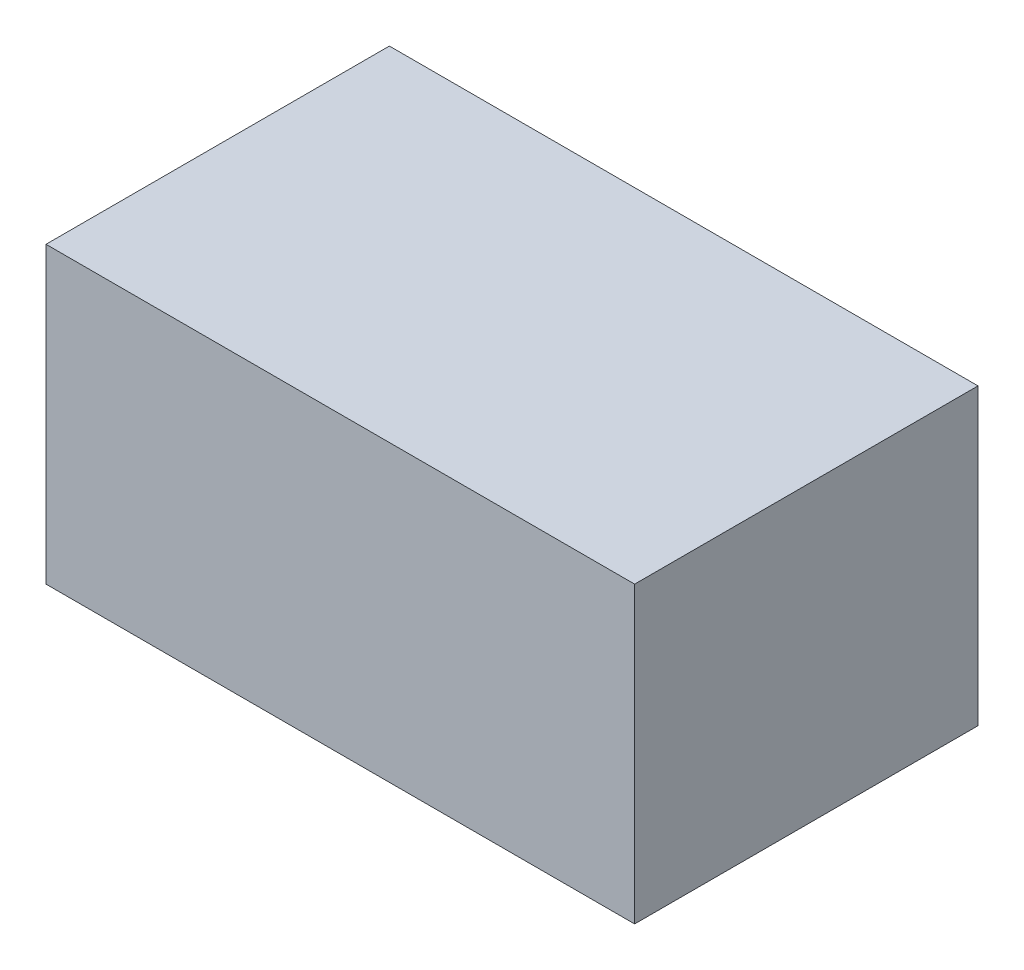
ISO-10303-21;
HEADER;
FILE_DESCRIPTION(('STEP AP214'),'2;1');
FILE_NAME('part.step','',(''),(''),'','','');
FILE_SCHEMA(('AUTOMOTIVE_DESIGN { 1 0 10303 214 1 1 1 1 }'));
ENDSEC;
DATA;
#1=APPLICATION_CONTEXT('core data for automotive mechanical design processes');
#2=APPLICATION_PROTOCOL_DEFINITION('international standard','automotive_design',2000,#1);
#3=PRODUCT_CONTEXT('',#1,'mechanical');
#4=PRODUCT('Part','Part','',(#3));
#5=PRODUCT_RELATED_PRODUCT_CATEGORY('part','',(#4));
#6=PRODUCT_DEFINITION_FORMATION('','',#4);
#7=PRODUCT_DEFINITION_CONTEXT('part definition',#1,'design');
#8=PRODUCT_DEFINITION('design','',#6,#7);
#9=PRODUCT_DEFINITION_SHAPE('','',#8);
#10=(LENGTH_UNIT() NAMED_UNIT(*) SI_UNIT(.MILLI.,.METRE.));
#11=(NAMED_UNIT(*) PLANE_ANGLE_UNIT() SI_UNIT($,.RADIAN.));
#12=(NAMED_UNIT(*) SI_UNIT($,.STERADIAN.) SOLID_ANGLE_UNIT());
#13=UNCERTAINTY_MEASURE_WITH_UNIT(LENGTH_MEASURE(1.E-05),#10,'distance_accuracy_value','');
#14=(GEOMETRIC_REPRESENTATION_CONTEXT(3) GLOBAL_UNCERTAINTY_ASSIGNED_CONTEXT((#13)) GLOBAL_UNIT_ASSIGNED_CONTEXT((#10,
#11,#12)) REPRESENTATION_CONTEXT('',''));
#15=CARTESIAN_POINT('',(0.,0.,0.));
#16=DIRECTION('',(0.,0.,1.));
#17=DIRECTION('',(1.,0.,0.));
#18=AXIS2_PLACEMENT_3D('',#15,#16,#17);
#19=CARTESIAN_POINT('',(69.5,53.,-26.5));
#20=DIRECTION('',(0.,0.,1.));
#21=DIRECTION('',(1.,0.,0.));
#22=AXIS2_PLACEMENT_3D('',#19,#20,#21);
#23=PLANE('',#22);
#24=DIRECTION('',(-1.,0.,0.));
#25=VECTOR('',#24,1.);
#26=CARTESIAN_POINT('',(-23.5,24.,-26.5));
#27=LINE('',#26,#25);
#28=CARTESIAN_POINT('',(-20.5,24.,-26.5));
#29=VERTEX_POINT('',#28);
#30=CARTESIAN_POINT('',(-43.5,24.,-26.5));
#31=VERTEX_POINT('',#30);
#32=EDGE_CURVE('E167',#29,#31,#27,.T.);
#33=ORIENTED_EDGE('',*,*,#32,.F.);
#34=DIRECTION('',(0.,-1.,0.));
#35=VECTOR('',#34,1.);
#36=CARTESIAN_POINT('',(-20.5,53.,-26.5));
#37=LINE('',#36,#35);
#38=CARTESIAN_POINT('',(-20.5,53.,-26.5));
#39=VERTEX_POINT('',#38);
#40=EDGE_CURVE('E166',#39,#29,#37,.T.);
#41=ORIENTED_EDGE('',*,*,#40,.F.);
#42=DIRECTION('',(-1.,0.,0.));
#43=VECTOR('',#42,1.);
#44=CARTESIAN_POINT('',(69.5,53.,-26.5));
#45=LINE('',#44,#43);
#46=CARTESIAN_POINT('',(-43.5,53.,-26.5));
#47=VERTEX_POINT('',#46);
#48=EDGE_CURVE('E150',#39,#47,#45,.T.);
#49=ORIENTED_EDGE('',*,*,#48,.T.);
#50=DIRECTION('',(0.,-1.,0.));
#51=VECTOR('',#50,1.);
#52=CARTESIAN_POINT('',(-43.5,53.,-26.5));
#53=LINE('',#52,#51);
#54=EDGE_CURVE('E214',#47,#31,#53,.T.);
#55=ORIENTED_EDGE('',*,*,#54,.T.);
#56=EDGE_LOOP('',(#33,#41,#49,#55));
#57=FACE_BOUND('',#56,.T.);
#58=ADVANCED_FACE('F39',(#57),#23,.T.);
#59=CARTESIAN_POINT('',(69.5,53.,-26.5));
#60=VERTEX_POINT('',#59);
#61=CARTESIAN_POINT('',(-15.5,53.,-26.5));
#62=VERTEX_POINT('',#61);
#63=EDGE_CURVE('E162',#60,#62,#45,.T.);
#64=ORIENTED_EDGE('',*,*,#63,.T.);
#65=DIRECTION('',(0.,1.,0.));
#66=VECTOR('',#65,1.);
#67=CARTESIAN_POINT('',(-15.5,21.,-26.5));
#68=LINE('',#67,#66);
#69=CARTESIAN_POINT('',(-15.5,21.,-26.5));
#70=VERTEX_POINT('',#69);
#71=EDGE_CURVE('E55',#70,#62,#68,.T.);
#72=ORIENTED_EDGE('',*,*,#71,.F.);
#73=DIRECTION('',(1.,0.,0.));
#74=VECTOR('',#73,1.);
#75=CARTESIAN_POINT('',(-36.5,21.,-26.5));
#76=LINE('',#75,#74);
#77=CARTESIAN_POINT('',(-36.5,21.,-26.5));
#78=VERTEX_POINT('',#77);
#79=EDGE_CURVE('E187',#78,#70,#76,.T.);
#80=ORIENTED_EDGE('',*,*,#79,.F.);
#81=DIRECTION('',(0.,-1.,0.));
#82=VECTOR('',#81,1.);
#83=CARTESIAN_POINT('',(-36.5,53.,-26.5));
#84=LINE('',#83,#82);
#85=CARTESIAN_POINT('',(-36.5,0.,-26.5));
#86=VERTEX_POINT('',#85);
#87=EDGE_CURVE('E268',#78,#86,#84,.T.);
#88=ORIENTED_EDGE('',*,*,#87,.T.);
#89=DIRECTION('',(-1.,0.,0.));
#90=VECTOR('',#89,1.);
#91=CARTESIAN_POINT('',(69.5,0.,-26.5));
#92=LINE('',#91,#90);
#93=CARTESIAN_POINT('',(69.5,0.,-26.5));
#94=VERTEX_POINT('',#93);
#95=EDGE_CURVE('E228',#94,#86,#92,.T.);
#96=ORIENTED_EDGE('',*,*,#95,.F.);
#97=DIRECTION('',(0.,-1.,0.));
#98=VECTOR('',#97,1.);
#99=CARTESIAN_POINT('',(69.5,53.,-26.5));
#100=LINE('',#99,#98);
#101=EDGE_CURVE('E244',#60,#94,#100,.T.);
#102=ORIENTED_EDGE('',*,*,#101,.F.);
#103=EDGE_LOOP('',(#64,#72,#80,#88,#96,#102));
#104=FACE_BOUND('',#103,.T.);
#105=ADVANCED_FACE('F338',(#104),#23,.T.);
#106=CARTESIAN_POINT('',(-36.5,53.,-26.5));
#107=DIRECTION('',(1.,0.,0.));
#108=DIRECTION('',(0.,0.,-1.));
#109=AXIS2_PLACEMENT_3D('',#106,#107,#108);
#110=PLANE('',#109);
#111=DIRECTION('',(0.,0.,-1.));
#112=VECTOR('',#111,1.);
#113=CARTESIAN_POINT('',(-36.5,21.,21.1984661191894));
#114=LINE('',#113,#112);
#115=CARTESIAN_POINT('',(-36.5,21.,21.1984661191894));
#116=VERTEX_POINT('',#115);
#117=EDGE_CURVE('E63',#116,#78,#114,.T.);
#118=ORIENTED_EDGE('',*,*,#117,.F.);
#119=DIRECTION('',(0.,1.,0.));
#120=VECTOR('',#119,1.);
#121=CARTESIAN_POINT('',(-36.5,21.,21.1984661191894));
#122=LINE('',#121,#120);
#123=CARTESIAN_POINT('',(-36.5,53.,21.1984661191894));
#124=VERTEX_POINT('',#123);
#125=EDGE_CURVE('E197',#116,#124,#122,.T.);
#126=ORIENTED_EDGE('',*,*,#125,.T.);
#127=DIRECTION('',(0.,0.,1.));
#128=VECTOR('',#127,1.);
#129=CARTESIAN_POINT('',(-36.5,53.,-26.5));
#130=LINE('',#129,#128);
#131=CARTESIAN_POINT('',(-36.5,53.,29.5));
#132=VERTEX_POINT('',#131);
#133=EDGE_CURVE('E235',#124,#132,#130,.T.);
#134=ORIENTED_EDGE('',*,*,#133,.T.);
#135=DIRECTION('',(0.,-1.,0.));
#136=VECTOR('',#135,1.);
#137=CARTESIAN_POINT('',(-36.5,53.,29.5));
#138=LINE('',#137,#136);
#139=CARTESIAN_POINT('',(-36.5,0.,29.5));
#140=VERTEX_POINT('',#139);
#141=EDGE_CURVE('E265',#132,#140,#138,.T.);
#142=ORIENTED_EDGE('',*,*,#141,.T.);
#143=DIRECTION('',(0.,0.,1.));
#144=VECTOR('',#143,1.);
#145=CARTESIAN_POINT('',(-36.5,0.,-26.5));
#146=LINE('',#145,#144);
#147=EDGE_CURVE('E248',#86,#140,#146,.T.);
#148=ORIENTED_EDGE('',*,*,#147,.F.);
#149=ORIENTED_EDGE('',*,*,#87,.F.);
#150=EDGE_LOOP('',(#118,#126,#134,#142,#148,#149));
#151=FACE_BOUND('',#150,.T.);
#152=ADVANCED_FACE('F344',(#151),#110,.T.);
#153=CARTESIAN_POINT('',(0.,53.,0.));
#154=DIRECTION('',(0.,1.,0.));
#155=DIRECTION('',(0.,0.,1.));
#156=AXIS2_PLACEMENT_3D('',#153,#154,#155);
#157=PLANE('',#156);
#158=ORIENTED_EDGE('',*,*,#48,.F.);
#159=DIRECTION('',(0.,0.,-1.));
#160=VECTOR('',#159,1.);
#161=CARTESIAN_POINT('',(-20.5,53.,16.5));
#162=LINE('',#161,#160);
#163=CARTESIAN_POINT('',(-20.5,53.,16.5));
#164=VERTEX_POINT('',#163);
#165=EDGE_CURVE('E154',#164,#39,#162,.T.);
#166=ORIENTED_EDGE('',*,*,#165,.F.);
#167=DIRECTION('',(-1.,0.,0.));
#168=VECTOR('',#167,1.);
#169=CARTESIAN_POINT('',(-23.5,53.,16.5));
#170=LINE('',#169,#168);
#171=CARTESIAN_POINT('',(-43.5,53.,16.5));
#172=VERTEX_POINT('',#171);
#173=EDGE_CURVE('E225',#164,#172,#170,.T.);
#174=ORIENTED_EDGE('',*,*,#173,.T.);
#175=DIRECTION('',(0.,0.,-1.));
#176=VECTOR('',#175,1.);
#177=CARTESIAN_POINT('',(-43.5,53.,16.5));
#178=LINE('',#177,#176);
#179=EDGE_CURVE('E157',#172,#47,#178,.T.);
#180=ORIENTED_EDGE('',*,*,#179,.T.);
#181=EDGE_LOOP('',(#158,#166,#174,#180));
#182=FACE_BOUND('',#181,.T.);
#183=ADVANCED_FACE('F152',(#182),#157,.F.);
#184=DIRECTION('',(0.,0.,1.));
#185=VECTOR('',#184,1.);
#186=CARTESIAN_POINT('',(-15.5,53.,21.1984661191894));
#187=LINE('',#186,#185);
#188=CARTESIAN_POINT('',(-15.5,53.,21.1984661191894));
#189=VERTEX_POINT('',#188);
#190=EDGE_CURVE('E184',#62,#189,#187,.T.);
#191=ORIENTED_EDGE('',*,*,#190,.F.);
#192=ORIENTED_EDGE('',*,*,#63,.F.);
#193=DIRECTION('',(0.,0.,-1.));
#194=VECTOR('',#193,1.);
#195=CARTESIAN_POINT('',(69.5,53.,29.5));
#196=LINE('',#195,#194);
#197=CARTESIAN_POINT('',(69.5,53.,29.5));
#198=VERTEX_POINT('',#197);
#199=EDGE_CURVE('E241',#198,#60,#196,.T.);
#200=ORIENTED_EDGE('',*,*,#199,.F.);
#201=DIRECTION('',(1.,0.,0.));
#202=VECTOR('',#201,1.);
#203=CARTESIAN_POINT('',(-36.5,53.,29.5));
#204=LINE('',#203,#202);
#205=EDGE_CURVE('E238',#132,#198,#204,.T.);
#206=ORIENTED_EDGE('',*,*,#205,.F.);
#207=ORIENTED_EDGE('',*,*,#133,.F.);
#208=DIRECTION('',(-1.,0.,0.));
#209=VECTOR('',#208,1.);
#210=CARTESIAN_POINT('',(-36.5,53.,21.1984661191894));
#211=LINE('',#210,#209);
#212=EDGE_CURVE('E188',#189,#124,#211,.T.);
#213=ORIENTED_EDGE('',*,*,#212,.F.);
#214=EDGE_LOOP('',(#191,#192,#200,#206,#207,#213));
#215=FACE_BOUND('',#214,.T.);
#216=ADVANCED_FACE('F353',(#215),#157,.F.);
#217=CARTESIAN_POINT('',(0.,0.,0.));
#218=DIRECTION('',(0.,1.,0.));
#219=DIRECTION('',(0.,0.,1.));
#220=AXIS2_PLACEMENT_3D('',#217,#218,#219);
#221=PLANE('',#220);
#222=DIRECTION('',(-1.,0.,0.));
#223=VECTOR('',#222,1.);
#224=CARTESIAN_POINT('',(76.5,0.,-33.5));
#225=LINE('',#224,#223);
#226=CARTESIAN_POINT('',(76.5,0.,-33.5));
#227=VERTEX_POINT('',#226);
#228=CARTESIAN_POINT('',(-43.5,0.,-33.5));
#229=VERTEX_POINT('',#228);
#230=EDGE_CURVE('E271',#227,#229,#225,.T.);
#231=ORIENTED_EDGE('',*,*,#230,.F.);
#232=DIRECTION('',(0.,0.,-1.));
#233=VECTOR('',#232,1.);
#234=CARTESIAN_POINT('',(76.5,0.,36.5));
#235=LINE('',#234,#233);
#236=CARTESIAN_POINT('',(76.5,0.,36.5));
#237=VERTEX_POINT('',#236);
#238=EDGE_CURVE('E277',#237,#227,#235,.T.);
#239=ORIENTED_EDGE('',*,*,#238,.F.);
#240=DIRECTION('',(1.,0.,0.));
#241=VECTOR('',#240,1.);
#242=CARTESIAN_POINT('',(-43.5,0.,36.5));
#243=LINE('',#242,#241);
#244=CARTESIAN_POINT('',(-43.5,0.,36.5));
#245=VERTEX_POINT('',#244);
#246=EDGE_CURVE('E293',#245,#237,#243,.T.);
#247=ORIENTED_EDGE('',*,*,#246,.F.);
#248=DIRECTION('',(0.,0.,1.));
#249=VECTOR('',#248,1.);
#250=CARTESIAN_POINT('',(-43.5,0.,-33.5));
#251=LINE('',#250,#249);
#252=EDGE_CURVE('E290',#229,#245,#251,.T.);
#253=ORIENTED_EDGE('',*,*,#252,.F.);
#254=EDGE_LOOP('',(#231,#239,#247,#253));
#255=FACE_BOUND('',#254,.T.);
#256=ORIENTED_EDGE('',*,*,#95,.T.);
#257=ORIENTED_EDGE('',*,*,#147,.T.);
#258=DIRECTION('',(1.,0.,0.));
#259=VECTOR('',#258,1.);
#260=CARTESIAN_POINT('',(-36.5,0.,29.5));
#261=LINE('',#260,#259);
#262=CARTESIAN_POINT('',(69.5,0.,29.5));
#263=VERTEX_POINT('',#262);
#264=EDGE_CURVE('E252',#140,#263,#261,.T.);
#265=ORIENTED_EDGE('',*,*,#264,.T.);
#266=DIRECTION('',(0.,0.,-1.));
#267=VECTOR('',#266,1.);
#268=CARTESIAN_POINT('',(69.5,0.,29.5));
#269=LINE('',#268,#267);
#270=EDGE_CURVE('E163',#263,#94,#269,.T.);
#271=ORIENTED_EDGE('',*,*,#270,.T.);
#272=EDGE_LOOP('',(#256,#257,#265,#271));
#273=FACE_BOUND('',#272,.T.);
#274=ADVANCED_FACE('F316',(#255,#273),#221,.F.);
#275=CARTESIAN_POINT('',(76.5,60.,-33.5));
#276=DIRECTION('',(0.,0.,1.));
#277=DIRECTION('',(1.,0.,0.));
#278=AXIS2_PLACEMENT_3D('',#275,#276,#277);
#279=PLANE('',#278);
#280=ORIENTED_EDGE('',*,*,#230,.T.);
#281=DIRECTION('',(0.,-1.,0.));
#282=VECTOR('',#281,1.);
#283=CARTESIAN_POINT('',(-43.5,60.,-33.5));
#284=LINE('',#283,#282);
#285=CARTESIAN_POINT('',(-43.5,60.,-33.5));
#286=VERTEX_POINT('',#285);
#287=EDGE_CURVE('E11',#286,#229,#284,.T.);
#288=ORIENTED_EDGE('',*,*,#287,.F.);
#289=DIRECTION('',(-1.,0.,0.));
#290=VECTOR('',#289,1.);
#291=CARTESIAN_POINT('',(76.5,60.,-33.5));
#292=LINE('',#291,#290);
#293=CARTESIAN_POINT('',(76.5,60.,-33.5));
#294=VERTEX_POINT('',#293);
#295=EDGE_CURVE('E272',#294,#286,#292,.T.);
#296=ORIENTED_EDGE('',*,*,#295,.F.);
#297=DIRECTION('',(0.,-1.,0.));
#298=VECTOR('',#297,1.);
#299=CARTESIAN_POINT('',(76.5,60.,-33.5));
#300=LINE('',#299,#298);
#301=EDGE_CURVE('E286',#294,#227,#300,.T.);
#302=ORIENTED_EDGE('',*,*,#301,.T.);
#303=EDGE_LOOP('',(#280,#288,#296,#302));
#304=FACE_BOUND('',#303,.T.);
#305=ADVANCED_FACE('F41',(#304),#279,.F.);
#306=CARTESIAN_POINT('',(-43.5,60.,-33.5));
#307=DIRECTION('',(1.,0.,0.));
#308=DIRECTION('',(0.,0.,-1.));
#309=AXIS2_PLACEMENT_3D('',#306,#307,#308);
#310=PLANE('',#309);
#311=ORIENTED_EDGE('',*,*,#54,.F.);
#312=ORIENTED_EDGE('',*,*,#179,.F.);
#313=DIRECTION('',(0.,1.,0.));
#314=VECTOR('',#313,1.);
#315=CARTESIAN_POINT('',(-43.5,24.,16.5));
#316=LINE('',#315,#314);
#317=CARTESIAN_POINT('',(-43.5,24.,16.5));
#318=VERTEX_POINT('',#317);
#319=EDGE_CURVE('E221',#318,#172,#316,.T.);
#320=ORIENTED_EDGE('',*,*,#319,.F.);
#321=DIRECTION('',(0.,0.,1.));
#322=VECTOR('',#321,1.);
#323=CARTESIAN_POINT('',(-43.5,24.,-26.5));
#324=LINE('',#323,#322);
#325=EDGE_CURVE('E217',#31,#318,#324,.T.);
#326=ORIENTED_EDGE('',*,*,#325,.F.);
#327=EDGE_LOOP('',(#311,#312,#320,#326));
#328=FACE_BOUND('',#327,.T.);
#329=ORIENTED_EDGE('',*,*,#252,.T.);
#330=DIRECTION('',(0.,-1.,0.));
#331=VECTOR('',#330,1.);
#332=CARTESIAN_POINT('',(-43.5,60.,36.5));
#333=LINE('',#332,#331);
#334=CARTESIAN_POINT('',(-43.5,60.,36.5));
#335=VERTEX_POINT('',#334);
#336=EDGE_CURVE('E48',#335,#245,#333,.T.);
#337=ORIENTED_EDGE('',*,*,#336,.F.);
#338=DIRECTION('',(0.,0.,1.));
#339=VECTOR('',#338,1.);
#340=CARTESIAN_POINT('',(-43.5,60.,-33.5));
#341=LINE('',#340,#339);
#342=EDGE_CURVE('E276',#286,#335,#341,.T.);
#343=ORIENTED_EDGE('',*,*,#342,.F.);
#344=ORIENTED_EDGE('',*,*,#287,.T.);
#345=EDGE_LOOP('',(#329,#337,#343,#344));
#346=FACE_BOUND('',#345,.T.);
#347=ADVANCED_FACE('F327',(#328,#346),#310,.F.);
#348=CARTESIAN_POINT('',(-43.5,60.,36.5));
#349=DIRECTION('',(0.,0.,-1.));
#350=DIRECTION('',(-1.,0.,0.));
#351=AXIS2_PLACEMENT_3D('',#348,#349,#350);
#352=PLANE('',#351);
#353=ORIENTED_EDGE('',*,*,#246,.T.);
#354=DIRECTION('',(0.,-1.,0.));
#355=VECTOR('',#354,1.);
#356=CARTESIAN_POINT('',(76.5,60.,36.5));
#357=LINE('',#356,#355);
#358=CARTESIAN_POINT('',(76.5,60.,36.5));
#359=VERTEX_POINT('',#358);
#360=EDGE_CURVE('E301',#359,#237,#357,.T.);
#361=ORIENTED_EDGE('',*,*,#360,.F.);
#362=DIRECTION('',(1.,0.,0.));
#363=VECTOR('',#362,1.);
#364=CARTESIAN_POINT('',(-43.5,60.,36.5));
#365=LINE('',#364,#363);
#366=EDGE_CURVE('E280',#335,#359,#365,.T.);
#367=ORIENTED_EDGE('',*,*,#366,.F.);
#368=ORIENTED_EDGE('',*,*,#336,.T.);
#369=EDGE_LOOP('',(#353,#361,#367,#368));
#370=FACE_BOUND('',#369,.T.);
#371=ADVANCED_FACE('F310',(#370),#352,.F.);
#372=CARTESIAN_POINT('',(76.5,60.,36.5));
#373=DIRECTION('',(-1.,0.,0.));
#374=DIRECTION('',(0.,0.,1.));
#375=AXIS2_PLACEMENT_3D('',#372,#373,#374);
#376=PLANE('',#375);
#377=ORIENTED_EDGE('',*,*,#238,.T.);
#378=ORIENTED_EDGE('',*,*,#301,.F.);
#379=DIRECTION('',(0.,0.,-1.));
#380=VECTOR('',#379,1.);
#381=CARTESIAN_POINT('',(76.5,60.,36.5));
#382=LINE('',#381,#380);
#383=EDGE_CURVE('E283',#359,#294,#382,.T.);
#384=ORIENTED_EDGE('',*,*,#383,.F.);
#385=ORIENTED_EDGE('',*,*,#360,.T.);
#386=EDGE_LOOP('',(#377,#378,#384,#385));
#387=FACE_BOUND('',#386,.T.);
#388=ADVANCED_FACE('F320',(#387),#376,.F.);
#389=CARTESIAN_POINT('',(0.,60.,0.));
#390=DIRECTION('',(0.,1.,0.));
#391=DIRECTION('',(0.,0.,1.));
#392=AXIS2_PLACEMENT_3D('',#389,#390,#391);
#393=PLANE('',#392);
#394=ORIENTED_EDGE('',*,*,#295,.T.);
#395=ORIENTED_EDGE('',*,*,#342,.T.);
#396=ORIENTED_EDGE('',*,*,#366,.T.);
#397=ORIENTED_EDGE('',*,*,#383,.T.);
#398=EDGE_LOOP('',(#394,#395,#396,#397));
#399=FACE_BOUND('',#398,.T.);
#400=ADVANCED_FACE('F326',(#399),#393,.T.);
#401=CARTESIAN_POINT('',(-36.5,53.,29.5));
#402=DIRECTION('',(0.,0.,-1.));
#403=DIRECTION('',(-1.,0.,0.));
#404=AXIS2_PLACEMENT_3D('',#401,#402,#403);
#405=PLANE('',#404);
#406=ORIENTED_EDGE('',*,*,#264,.F.);
#407=ORIENTED_EDGE('',*,*,#141,.F.);
#408=ORIENTED_EDGE('',*,*,#205,.T.);
#409=DIRECTION('',(0.,-1.,0.));
#410=VECTOR('',#409,1.);
#411=CARTESIAN_POINT('',(69.5,53.,29.5));
#412=LINE('',#411,#410);
#413=EDGE_CURVE('E262',#198,#263,#412,.T.);
#414=ORIENTED_EDGE('',*,*,#413,.T.);
#415=EDGE_LOOP('',(#406,#407,#408,#414));
#416=FACE_BOUND('',#415,.T.);
#417=ADVANCED_FACE('F350',(#416),#405,.T.);
#418=CARTESIAN_POINT('',(69.5,53.,29.5));
#419=DIRECTION('',(-1.,0.,0.));
#420=DIRECTION('',(0.,0.,1.));
#421=AXIS2_PLACEMENT_3D('',#418,#419,#420);
#422=PLANE('',#421);
#423=ORIENTED_EDGE('',*,*,#270,.F.);
#424=ORIENTED_EDGE('',*,*,#413,.F.);
#425=ORIENTED_EDGE('',*,*,#199,.T.);
#426=ORIENTED_EDGE('',*,*,#101,.T.);
#427=EDGE_LOOP('',(#423,#424,#425,#426));
#428=FACE_BOUND('',#427,.T.);
#429=ADVANCED_FACE('F370',(#428),#422,.T.);
#430=CARTESIAN_POINT('',(-23.5,24.,16.5));
#431=DIRECTION('',(0.,0.,1.));
#432=DIRECTION('',(0.,-1.,0.));
#433=AXIS2_PLACEMENT_3D('',#430,#431,#432);
#434=PLANE('',#433);
#435=ORIENTED_EDGE('',*,*,#173,.F.);
#436=DIRECTION('',(0.,1.,0.));
#437=VECTOR('',#436,1.);
#438=CARTESIAN_POINT('',(-20.5,24.,16.5));
#439=LINE('',#438,#437);
#440=CARTESIAN_POINT('',(-20.5,24.,16.5));
#441=VERTEX_POINT('',#440);
#442=EDGE_CURVE('E176',#441,#164,#439,.T.);
#443=ORIENTED_EDGE('',*,*,#442,.F.);
#444=DIRECTION('',(-1.,0.,0.));
#445=VECTOR('',#444,1.);
#446=CARTESIAN_POINT('',(-23.5,24.,16.5));
#447=LINE('',#446,#445);
#448=EDGE_CURVE('E229',#441,#318,#447,.T.);
#449=ORIENTED_EDGE('',*,*,#448,.T.);
#450=ORIENTED_EDGE('',*,*,#319,.T.);
#451=EDGE_LOOP('',(#435,#443,#449,#450));
#452=FACE_BOUND('',#451,.T.);
#453=ADVANCED_FACE('F375',(#452),#434,.F.);
#454=CARTESIAN_POINT('',(-23.5,24.,-26.5));
#455=DIRECTION('',(0.,-1.,0.));
#456=DIRECTION('',(0.,0.,-1.));
#457=AXIS2_PLACEMENT_3D('',#454,#455,#456);
#458=PLANE('',#457);
#459=ORIENTED_EDGE('',*,*,#448,.F.);
#460=DIRECTION('',(0.,0.,1.));
#461=VECTOR('',#460,1.);
#462=CARTESIAN_POINT('',(-20.5,24.,-26.5));
#463=LINE('',#462,#461);
#464=EDGE_CURVE('E172',#29,#441,#463,.T.);
#465=ORIENTED_EDGE('',*,*,#464,.F.);
#466=ORIENTED_EDGE('',*,*,#32,.T.);
#467=ORIENTED_EDGE('',*,*,#325,.T.);
#468=EDGE_LOOP('',(#459,#465,#466,#467));
#469=FACE_BOUND('',#468,.T.);
#470=ADVANCED_FACE('F417',(#469),#458,.F.);
#471=CARTESIAN_POINT('',(-15.5,21.,21.1984661191894));
#472=DIRECTION('',(-1.,0.,0.));
#473=DIRECTION('',(0.,0.,1.));
#474=AXIS2_PLACEMENT_3D('',#471,#472,#473);
#475=PLANE('',#474);
#476=ORIENTED_EDGE('',*,*,#190,.T.);
#477=DIRECTION('',(0.,1.,0.));
#478=VECTOR('',#477,1.);
#479=CARTESIAN_POINT('',(-15.5,21.,21.1984661191894));
#480=LINE('',#479,#478);
#481=CARTESIAN_POINT('',(-15.5,21.,21.1984661191894));
#482=VERTEX_POINT('',#481);
#483=EDGE_CURVE('E206',#482,#189,#480,.T.);
#484=ORIENTED_EDGE('',*,*,#483,.F.);
#485=DIRECTION('',(0.,0.,1.));
#486=VECTOR('',#485,1.);
#487=CARTESIAN_POINT('',(-15.5,21.,21.1984661191894));
#488=LINE('',#487,#486);
#489=EDGE_CURVE('E191',#70,#482,#488,.T.);
#490=ORIENTED_EDGE('',*,*,#489,.F.);
#491=ORIENTED_EDGE('',*,*,#71,.T.);
#492=EDGE_LOOP('',(#476,#484,#490,#491));
#493=FACE_BOUND('',#492,.T.);
#494=ADVANCED_FACE('F410',(#493),#475,.F.);
#495=CARTESIAN_POINT('',(-36.5,21.,21.1984661191894));
#496=DIRECTION('',(0.,0.,-1.));
#497=DIRECTION('',(-1.,0.,0.));
#498=AXIS2_PLACEMENT_3D('',#495,#496,#497);
#499=PLANE('',#498);
#500=ORIENTED_EDGE('',*,*,#212,.T.);
#501=ORIENTED_EDGE('',*,*,#125,.F.);
#502=DIRECTION('',(-1.,0.,0.));
#503=VECTOR('',#502,1.);
#504=CARTESIAN_POINT('',(-36.5,21.,21.1984661191894));
#505=LINE('',#504,#503);
#506=EDGE_CURVE('E194',#482,#116,#505,.T.);
#507=ORIENTED_EDGE('',*,*,#506,.F.);
#508=ORIENTED_EDGE('',*,*,#483,.T.);
#509=EDGE_LOOP('',(#500,#501,#507,#508));
#510=FACE_BOUND('',#509,.T.);
#511=ADVANCED_FACE('F416',(#510),#499,.F.);
#512=CARTESIAN_POINT('',(0.,21.,0.));
#513=DIRECTION('',(0.,-1.,0.));
#514=DIRECTION('',(0.,0.,-1.));
#515=AXIS2_PLACEMENT_3D('',#512,#513,#514);
#516=PLANE('',#515);
#517=ORIENTED_EDGE('',*,*,#117,.T.);
#518=ORIENTED_EDGE('',*,*,#79,.T.);
#519=ORIENTED_EDGE('',*,*,#489,.T.);
#520=ORIENTED_EDGE('',*,*,#506,.T.);
#521=EDGE_LOOP('',(#517,#518,#519,#520));
#522=FACE_BOUND('',#521,.T.);
#523=ADVANCED_FACE('F425',(#522),#516,.T.);
#524=CARTESIAN_POINT('',(-20.5,0.,0.));
#525=DIRECTION('',(-1.,0.,0.));
#526=DIRECTION('',(0.,0.,1.));
#527=AXIS2_PLACEMENT_3D('',#524,#525,#526);
#528=PLANE('',#527);
#529=ORIENTED_EDGE('',*,*,#165,.T.);
#530=ORIENTED_EDGE('',*,*,#40,.T.);
#531=ORIENTED_EDGE('',*,*,#464,.T.);
#532=ORIENTED_EDGE('',*,*,#442,.T.);
#533=EDGE_LOOP('',(#529,#530,#531,#532));
#534=FACE_BOUND('',#533,.T.);
#535=ADVANCED_FACE('F174',(#534),#528,.T.);
#536=CLOSED_SHELL('',(#58,#105,#152,#183,#216,#274,#305,#347,#371,#388,#400,#417,#429,#453,#470,
#494,#511,#523,#535));
#537=MANIFOLD_SOLID_BREP('B2',#536);
#538=ADVANCED_BREP_SHAPE_REPRESENTATION('',(#18,#537),#14);
#539=SHAPE_DEFINITION_REPRESENTATION(#9,#538);
ENDSEC;
END-ISO-10303-21;
